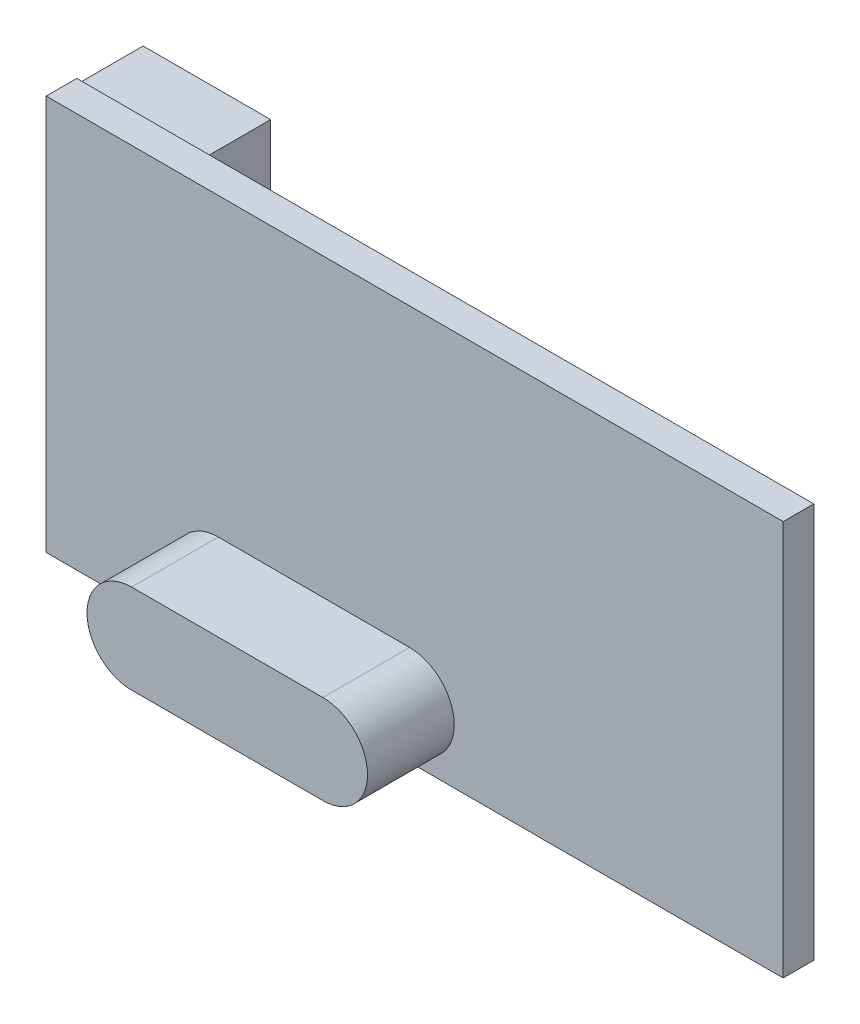
ISO-10303-21;
HEADER;
FILE_DESCRIPTION(('STEP AP214'),'2;1');
FILE_NAME('part.step','',(''),(''),'','','');
FILE_SCHEMA(('AUTOMOTIVE_DESIGN { 1 0 10303 214 1 1 1 1 }'));
ENDSEC;
DATA;
#1=APPLICATION_CONTEXT('core data for automotive mechanical design processes');
#2=APPLICATION_PROTOCOL_DEFINITION('international standard','automotive_design',2000,#1);
#3=PRODUCT_CONTEXT('',#1,'mechanical');
#4=PRODUCT('Part','Part','',(#3));
#5=PRODUCT_RELATED_PRODUCT_CATEGORY('part','',(#4));
#6=PRODUCT_DEFINITION_FORMATION('','',#4);
#7=PRODUCT_DEFINITION_CONTEXT('part definition',#1,'design');
#8=PRODUCT_DEFINITION('design','',#6,#7);
#9=PRODUCT_DEFINITION_SHAPE('','',#8);
#10=(LENGTH_UNIT() NAMED_UNIT(*) SI_UNIT(.MILLI.,.METRE.));
#11=(NAMED_UNIT(*) PLANE_ANGLE_UNIT() SI_UNIT($,.RADIAN.));
#12=(NAMED_UNIT(*) SI_UNIT($,.STERADIAN.) SOLID_ANGLE_UNIT());
#13=UNCERTAINTY_MEASURE_WITH_UNIT(LENGTH_MEASURE(1.E-05),#10,'distance_accuracy_value','');
#14=(GEOMETRIC_REPRESENTATION_CONTEXT(3) GLOBAL_UNCERTAINTY_ASSIGNED_CONTEXT((#13)) GLOBAL_UNIT_ASSIGNED_CONTEXT((#10,
#11,#12)) REPRESENTATION_CONTEXT('',''));
#15=CARTESIAN_POINT('',(0.,0.,0.));
#16=DIRECTION('',(0.,0.,1.));
#17=DIRECTION('',(1.,0.,0.));
#18=AXIS2_PLACEMENT_3D('',#15,#16,#17);
#19=CARTESIAN_POINT('',(0.,-25.6493279735981,0.));
#20=DIRECTION('',(0.,0.,1.));
#21=DIRECTION('',(1.,0.,0.));
#22=AXIS2_PLACEMENT_3D('',#19,#20,#21);
#23=PLANE('',#22);
#24=DIRECTION('',(0.,-1.,0.));
#25=VECTOR('',#24,1.);
#26=CARTESIAN_POINT('',(-14.45,-25.6493279735981,0.));
#27=LINE('',#26,#25);
#28=CARTESIAN_POINT('',(-14.45,7.75,0.));
#29=VERTEX_POINT('',#28);
#30=CARTESIAN_POINT('',(-14.45,-7.75,0.));
#31=VERTEX_POINT('',#30);
#32=EDGE_CURVE('E177',#29,#31,#27,.T.);
#33=ORIENTED_EDGE('',*,*,#32,.F.);
#34=DIRECTION('',(1.,0.,0.));
#35=VECTOR('',#34,1.);
#36=CARTESIAN_POINT('',(0.,7.75,0.));
#37=LINE('',#36,#35);
#38=CARTESIAN_POINT('',(14.45,7.75,0.));
#39=VERTEX_POINT('',#38);
#40=EDGE_CURVE('E182',#29,#39,#37,.T.);
#41=ORIENTED_EDGE('',*,*,#40,.T.);
#42=DIRECTION('',(0.,-1.,0.));
#43=VECTOR('',#42,1.);
#44=CARTESIAN_POINT('',(14.45,-25.6493279735981,0.));
#45=LINE('',#44,#43);
#46=CARTESIAN_POINT('',(14.45,-7.75,0.));
#47=VERTEX_POINT('',#46);
#48=EDGE_CURVE('E196',#39,#47,#45,.T.);
#49=ORIENTED_EDGE('',*,*,#48,.T.);
#50=DIRECTION('',(1.,0.,0.));
#51=VECTOR('',#50,1.);
#52=CARTESIAN_POINT('',(0.,-7.75,0.));
#53=LINE('',#52,#51);
#54=EDGE_CURVE('E193',#31,#47,#53,.T.);
#55=ORIENTED_EDGE('',*,*,#54,.F.);
#56=EDGE_LOOP('',(#33,#41,#49,#55));
#57=FACE_BOUND('',#56,.T.);
#58=DIRECTION('',(0.,1.,0.));
#59=VECTOR('',#58,1.);
#60=CARTESIAN_POINT('',(-14.35,7.65,0.));
#61=LINE('',#60,#59);
#62=CARTESIAN_POINT('',(-14.35,-2.35,0.));
#63=VERTEX_POINT('',#62);
#64=CARTESIAN_POINT('',(-14.35,7.65,0.));
#65=VERTEX_POINT('',#64);
#66=EDGE_CURVE('E142',#63,#65,#61,.T.);
#67=ORIENTED_EDGE('',*,*,#66,.F.);
#68=DIRECTION('',(-1.,0.,0.));
#69=VECTOR('',#68,1.);
#70=CARTESIAN_POINT('',(-14.35,-2.35,0.));
#71=LINE('',#70,#69);
#72=CARTESIAN_POINT('',(-9.35,-2.35,0.));
#73=VERTEX_POINT('',#72);
#74=EDGE_CURVE('E139',#73,#63,#71,.T.);
#75=ORIENTED_EDGE('',*,*,#74,.F.);
#76=DIRECTION('',(0.,-1.,0.));
#77=VECTOR('',#76,1.);
#78=CARTESIAN_POINT('',(-9.35,7.65,0.));
#79=LINE('',#78,#77);
#80=CARTESIAN_POINT('',(-9.35,7.65,0.));
#81=VERTEX_POINT('',#80);
#82=EDGE_CURVE('E53',#81,#73,#79,.T.);
#83=ORIENTED_EDGE('',*,*,#82,.F.);
#84=DIRECTION('',(1.,0.,0.));
#85=VECTOR('',#84,1.);
#86=CARTESIAN_POINT('',(-14.35,7.65,0.));
#87=LINE('',#86,#85);
#88=EDGE_CURVE('E48',#65,#81,#87,.T.);
#89=ORIENTED_EDGE('',*,*,#88,.F.);
#90=EDGE_LOOP('',(#67,#75,#83,#89));
#91=FACE_BOUND('',#90,.T.);
#92=ADVANCED_FACE('F33',(#57,#91),#23,.F.);
#93=CARTESIAN_POINT('',(0.,-25.6493279735981,1.2));
#94=DIRECTION('',(0.,0.,1.));
#95=DIRECTION('',(1.,0.,0.));
#96=AXIS2_PLACEMENT_3D('',#93,#94,#95);
#97=PLANE('',#96);
#98=DIRECTION('',(0.,-1.,0.));
#99=VECTOR('',#98,1.);
#100=CARTESIAN_POINT('',(-14.45,-25.6493279735981,1.2));
#101=LINE('',#100,#99);
#102=CARTESIAN_POINT('',(-14.45,7.75,1.2));
#103=VERTEX_POINT('',#102);
#104=CARTESIAN_POINT('',(-14.45,-7.75,1.2));
#105=VERTEX_POINT('',#104);
#106=EDGE_CURVE('E178',#103,#105,#101,.T.);
#107=ORIENTED_EDGE('',*,*,#106,.T.);
#108=DIRECTION('',(1.,0.,0.));
#109=VECTOR('',#108,1.);
#110=CARTESIAN_POINT('',(0.,-7.75,1.2));
#111=LINE('',#110,#109);
#112=CARTESIAN_POINT('',(14.45,-7.75,1.2));
#113=VERTEX_POINT('',#112);
#114=EDGE_CURVE('E181',#105,#113,#111,.T.);
#115=ORIENTED_EDGE('',*,*,#114,.T.);
#116=DIRECTION('',(0.,-1.,0.));
#117=VECTOR('',#116,1.);
#118=CARTESIAN_POINT('',(14.45,-25.6493279735981,1.2));
#119=LINE('',#118,#117);
#120=CARTESIAN_POINT('',(14.45,7.75,1.2));
#121=VERTEX_POINT('',#120);
#122=EDGE_CURVE('E184',#121,#113,#119,.T.);
#123=ORIENTED_EDGE('',*,*,#122,.F.);
#124=DIRECTION('',(1.,0.,0.));
#125=VECTOR('',#124,1.);
#126=CARTESIAN_POINT('',(0.,7.75,1.2));
#127=LINE('',#126,#125);
#128=EDGE_CURVE('E187',#103,#121,#127,.T.);
#129=ORIENTED_EDGE('',*,*,#128,.F.);
#130=EDGE_LOOP('',(#107,#115,#123,#129));
#131=FACE_BOUND('',#130,.T.);
#132=DIRECTION('',(1.,0.,0.));
#133=VECTOR('',#132,1.);
#134=CARTESIAN_POINT('',(-7.7,-7.35,1.2));
#135=LINE('',#134,#133);
#136=CARTESIAN_POINT('',(-7.7,-7.35,1.2));
#137=VERTEX_POINT('',#136);
#138=CARTESIAN_POINT('',(-0.199999999999999,-7.35,1.2));
#139=VERTEX_POINT('',#138);
#140=EDGE_CURVE('E146',#137,#139,#135,.T.);
#141=ORIENTED_EDGE('',*,*,#140,.F.);
#142=CARTESIAN_POINT('',(-7.7,-5.6,1.2));
#143=DIRECTION('',(0.,0.,1.));
#144=DIRECTION('',(1.,0.,0.));
#145=AXIS2_PLACEMENT_3D('',#142,#143,#144);
#146=CIRCLE('',#145,1.75);
#147=CARTESIAN_POINT('',(-7.7,-3.85,1.2));
#148=VERTEX_POINT('',#147);
#149=EDGE_CURVE('E143',#148,#137,#146,.T.);
#150=ORIENTED_EDGE('',*,*,#149,.F.);
#151=DIRECTION('',(-1.,0.,0.));
#152=VECTOR('',#151,1.);
#153=CARTESIAN_POINT('',(-7.7,-3.85,1.2));
#154=LINE('',#153,#152);
#155=CARTESIAN_POINT('',(-0.2,-3.85,1.2));
#156=VERTEX_POINT('',#155);
#157=EDGE_CURVE('E156',#156,#148,#154,.T.);
#158=ORIENTED_EDGE('',*,*,#157,.F.);
#159=CARTESIAN_POINT('',(-0.2,-5.6,1.2));
#160=DIRECTION('',(0.,0.,1.));
#161=DIRECTION('',(-1.,0.,0.));
#162=AXIS2_PLACEMENT_3D('',#159,#160,#161);
#163=CIRCLE('',#162,1.75);
#164=EDGE_CURVE('E164',#139,#156,#163,.T.);
#165=ORIENTED_EDGE('',*,*,#164,.F.);
#166=EDGE_LOOP('',(#141,#150,#158,#165));
#167=FACE_BOUND('',#166,.T.);
#168=ADVANCED_FACE('F219',(#131,#167),#97,.T.);
#169=CARTESIAN_POINT('',(-14.45,-25.6493279735981,1.2));
#170=DIRECTION('',(1.,0.,0.));
#171=DIRECTION('',(0.,1.,0.));
#172=AXIS2_PLACEMENT_3D('',#169,#170,#171);
#173=PLANE('',#172);
#174=ORIENTED_EDGE('',*,*,#32,.T.);
#175=DIRECTION('',(0.,0.,-1.));
#176=VECTOR('',#175,1.);
#177=CARTESIAN_POINT('',(-14.45,-7.75,1.2));
#178=LINE('',#177,#176);
#179=EDGE_CURVE('E11',#105,#31,#178,.T.);
#180=ORIENTED_EDGE('',*,*,#179,.F.);
#181=ORIENTED_EDGE('',*,*,#106,.F.);
#182=DIRECTION('',(0.,0.,-1.));
#183=VECTOR('',#182,1.);
#184=CARTESIAN_POINT('',(-14.45,7.75,1.2));
#185=LINE('',#184,#183);
#186=EDGE_CURVE('E190',#103,#29,#185,.T.);
#187=ORIENTED_EDGE('',*,*,#186,.T.);
#188=EDGE_LOOP('',(#174,#180,#181,#187));
#189=FACE_BOUND('',#188,.T.);
#190=ADVANCED_FACE('F35',(#189),#173,.F.);
#191=CARTESIAN_POINT('',(0.,-7.75,1.2));
#192=DIRECTION('',(0.,1.,0.));
#193=DIRECTION('',(0.,0.,1.));
#194=AXIS2_PLACEMENT_3D('',#191,#192,#193);
#195=PLANE('',#194);
#196=ORIENTED_EDGE('',*,*,#54,.T.);
#197=DIRECTION('',(0.,0.,-1.));
#198=VECTOR('',#197,1.);
#199=CARTESIAN_POINT('',(14.45,-7.75,1.2));
#200=LINE('',#199,#198);
#201=EDGE_CURVE('E41',#113,#47,#200,.T.);
#202=ORIENTED_EDGE('',*,*,#201,.F.);
#203=ORIENTED_EDGE('',*,*,#114,.F.);
#204=ORIENTED_EDGE('',*,*,#179,.T.);
#205=EDGE_LOOP('',(#196,#202,#203,#204));
#206=FACE_BOUND('',#205,.T.);
#207=ADVANCED_FACE('F209',(#206),#195,.F.);
#208=CARTESIAN_POINT('',(14.45,-25.6493279735981,1.2));
#209=DIRECTION('',(1.,0.,0.));
#210=DIRECTION('',(0.,1.,0.));
#211=AXIS2_PLACEMENT_3D('',#208,#209,#210);
#212=PLANE('',#211);
#213=ORIENTED_EDGE('',*,*,#48,.F.);
#214=DIRECTION('',(0.,0.,-1.));
#215=VECTOR('',#214,1.);
#216=CARTESIAN_POINT('',(14.45,7.75,1.2));
#217=LINE('',#216,#215);
#218=EDGE_CURVE('E202',#121,#39,#217,.T.);
#219=ORIENTED_EDGE('',*,*,#218,.F.);
#220=ORIENTED_EDGE('',*,*,#122,.T.);
#221=ORIENTED_EDGE('',*,*,#201,.T.);
#222=EDGE_LOOP('',(#213,#219,#220,#221));
#223=FACE_BOUND('',#222,.T.);
#224=ADVANCED_FACE('F206',(#223),#212,.T.);
#225=CARTESIAN_POINT('',(0.,7.75,1.2));
#226=DIRECTION('',(0.,1.,0.));
#227=DIRECTION('',(0.,0.,1.));
#228=AXIS2_PLACEMENT_3D('',#225,#226,#227);
#229=PLANE('',#228);
#230=ORIENTED_EDGE('',*,*,#40,.F.);
#231=ORIENTED_EDGE('',*,*,#186,.F.);
#232=ORIENTED_EDGE('',*,*,#128,.T.);
#233=ORIENTED_EDGE('',*,*,#218,.T.);
#234=EDGE_LOOP('',(#230,#231,#232,#233));
#235=FACE_BOUND('',#234,.T.);
#236=ADVANCED_FACE('F215',(#235),#229,.T.);
#237=CARTESIAN_POINT('',(-7.7,-5.6,4.6));
#238=DIRECTION('',(0.,0.,-1.));
#239=DIRECTION('',(-1.,0.,0.));
#240=AXIS2_PLACEMENT_3D('',#237,#238,#239);
#241=CYLINDRICAL_SURFACE('',#240,1.75);
#242=ORIENTED_EDGE('',*,*,#149,.T.);
#243=DIRECTION('',(0.,0.,-1.));
#244=VECTOR('',#243,1.);
#245=CARTESIAN_POINT('',(-7.7,-7.35,4.6));
#246=LINE('',#245,#244);
#247=CARTESIAN_POINT('',(-7.7,-7.35,4.6));
#248=VERTEX_POINT('',#247);
#249=EDGE_CURVE('E175',#248,#137,#246,.T.);
#250=ORIENTED_EDGE('',*,*,#249,.F.);
#251=CARTESIAN_POINT('',(-7.7,-5.6,4.6));
#252=DIRECTION('',(0.,0.,1.));
#253=DIRECTION('',(1.,0.,0.));
#254=AXIS2_PLACEMENT_3D('',#251,#252,#253);
#255=CIRCLE('',#254,1.75);
#256=CARTESIAN_POINT('',(-7.7,-3.85,4.6));
#257=VERTEX_POINT('',#256);
#258=EDGE_CURVE('E152',#257,#248,#255,.T.);
#259=ORIENTED_EDGE('',*,*,#258,.F.);
#260=DIRECTION('',(0.,0.,-1.));
#261=VECTOR('',#260,1.);
#262=CARTESIAN_POINT('',(-7.7,-3.85,4.6));
#263=LINE('',#262,#261);
#264=EDGE_CURVE('E161',#257,#148,#263,.T.);
#265=ORIENTED_EDGE('',*,*,#264,.T.);
#266=EDGE_LOOP('',(#242,#250,#259,#265));
#267=FACE_BOUND('',#266,.T.);
#268=ADVANCED_FACE('F236',(#267),#241,.T.);
#269=CARTESIAN_POINT('',(-7.7,-7.35,4.6));
#270=DIRECTION('',(0.,1.,0.));
#271=DIRECTION('',(0.,0.,1.));
#272=AXIS2_PLACEMENT_3D('',#269,#270,#271);
#273=PLANE('',#272);
#274=ORIENTED_EDGE('',*,*,#140,.T.);
#275=DIRECTION('',(0.,0.,-1.));
#276=VECTOR('',#275,1.);
#277=CARTESIAN_POINT('',(-0.199999999999999,-7.35,4.6));
#278=LINE('',#277,#276);
#279=CARTESIAN_POINT('',(-0.199999999999999,-7.35,4.6));
#280=VERTEX_POINT('',#279);
#281=EDGE_CURVE('E172',#280,#139,#278,.T.);
#282=ORIENTED_EDGE('',*,*,#281,.F.);
#283=DIRECTION('',(1.,0.,0.));
#284=VECTOR('',#283,1.);
#285=CARTESIAN_POINT('',(-7.7,-7.35,4.6));
#286=LINE('',#285,#284);
#287=EDGE_CURVE('E155',#248,#280,#286,.T.);
#288=ORIENTED_EDGE('',*,*,#287,.F.);
#289=ORIENTED_EDGE('',*,*,#249,.T.);
#290=EDGE_LOOP('',(#274,#282,#288,#289));
#291=FACE_BOUND('',#290,.T.);
#292=ADVANCED_FACE('F253',(#291),#273,.F.);
#293=CARTESIAN_POINT('',(-0.2,-5.6,4.6));
#294=DIRECTION('',(0.,0.,-1.));
#295=DIRECTION('',(-1.,0.,0.));
#296=AXIS2_PLACEMENT_3D('',#293,#294,#295);
#297=CYLINDRICAL_SURFACE('',#296,1.75);
#298=ORIENTED_EDGE('',*,*,#164,.T.);
#299=DIRECTION('',(0.,0.,-1.));
#300=VECTOR('',#299,1.);
#301=CARTESIAN_POINT('',(-0.2,-3.85,4.6));
#302=LINE('',#301,#300);
#303=CARTESIAN_POINT('',(-0.2,-3.85,4.6));
#304=VERTEX_POINT('',#303);
#305=EDGE_CURVE('E170',#304,#156,#302,.T.);
#306=ORIENTED_EDGE('',*,*,#305,.F.);
#307=CARTESIAN_POINT('',(-0.2,-5.6,4.6));
#308=DIRECTION('',(0.,0.,1.));
#309=DIRECTION('',(-1.,0.,0.));
#310=AXIS2_PLACEMENT_3D('',#307,#308,#309);
#311=CIRCLE('',#310,1.75);
#312=EDGE_CURVE('E158',#280,#304,#311,.T.);
#313=ORIENTED_EDGE('',*,*,#312,.F.);
#314=ORIENTED_EDGE('',*,*,#281,.T.);
#315=EDGE_LOOP('',(#298,#306,#313,#314));
#316=FACE_BOUND('',#315,.T.);
#317=ADVANCED_FACE('F260',(#316),#297,.T.);
#318=CARTESIAN_POINT('',(-7.7,-3.85,4.6));
#319=DIRECTION('',(0.,-1.,0.));
#320=DIRECTION('',(0.,0.,-1.));
#321=AXIS2_PLACEMENT_3D('',#318,#319,#320);
#322=PLANE('',#321);
#323=ORIENTED_EDGE('',*,*,#157,.T.);
#324=ORIENTED_EDGE('',*,*,#264,.F.);
#325=DIRECTION('',(-1.,0.,0.));
#326=VECTOR('',#325,1.);
#327=CARTESIAN_POINT('',(-7.7,-3.85,4.6));
#328=LINE('',#327,#326);
#329=EDGE_CURVE('E160',#304,#257,#328,.T.);
#330=ORIENTED_EDGE('',*,*,#329,.F.);
#331=ORIENTED_EDGE('',*,*,#305,.T.);
#332=EDGE_LOOP('',(#323,#324,#330,#331));
#333=FACE_BOUND('',#332,.T.);
#334=ADVANCED_FACE('F268',(#333),#322,.F.);
#335=CARTESIAN_POINT('',(-7.7,-5.6,4.6));
#336=DIRECTION('',(0.,0.,1.));
#337=DIRECTION('',(1.,0.,0.));
#338=AXIS2_PLACEMENT_3D('',#335,#336,#337);
#339=PLANE('',#338);
#340=ORIENTED_EDGE('',*,*,#258,.T.);
#341=ORIENTED_EDGE('',*,*,#287,.T.);
#342=ORIENTED_EDGE('',*,*,#312,.T.);
#343=ORIENTED_EDGE('',*,*,#329,.T.);
#344=EDGE_LOOP('',(#340,#341,#342,#343));
#345=FACE_BOUND('',#344,.T.);
#346=ADVANCED_FACE('F276',(#345),#339,.T.);
#347=CARTESIAN_POINT('',(-14.35,7.65,-2.5));
#348=DIRECTION('',(1.,0.,0.));
#349=DIRECTION('',(0.,0.,-1.));
#350=AXIS2_PLACEMENT_3D('',#347,#348,#349);
#351=PLANE('',#350);
#352=ORIENTED_EDGE('',*,*,#66,.T.);
#353=DIRECTION('',(0.,0.,1.));
#354=VECTOR('',#353,1.);
#355=CARTESIAN_POINT('',(-14.35,7.65,-2.5));
#356=LINE('',#355,#354);
#357=CARTESIAN_POINT('',(-14.35,7.65,-2.5));
#358=VERTEX_POINT('',#357);
#359=EDGE_CURVE('E123',#358,#65,#356,.T.);
#360=ORIENTED_EDGE('',*,*,#359,.F.);
#361=DIRECTION('',(0.,1.,0.));
#362=VECTOR('',#361,1.);
#363=CARTESIAN_POINT('',(-14.35,7.65,-2.5));
#364=LINE('',#363,#362);
#365=CARTESIAN_POINT('',(-14.35,-2.35,-2.5));
#366=VERTEX_POINT('',#365);
#367=EDGE_CURVE('E130',#366,#358,#364,.T.);
#368=ORIENTED_EDGE('',*,*,#367,.F.);
#369=DIRECTION('',(0.,0.,1.));
#370=VECTOR('',#369,1.);
#371=CARTESIAN_POINT('',(-14.35,-2.35,-2.5));
#372=LINE('',#371,#370);
#373=EDGE_CURVE('E370',#366,#63,#372,.T.);
#374=ORIENTED_EDGE('',*,*,#373,.T.);
#375=EDGE_LOOP('',(#352,#360,#368,#374));
#376=FACE_BOUND('',#375,.T.);
#377=ADVANCED_FACE('F141',(#376),#351,.F.);
#378=CARTESIAN_POINT('',(-14.35,7.65,-2.5));
#379=DIRECTION('',(0.,-1.,0.));
#380=DIRECTION('',(1.,0.,0.));
#381=AXIS2_PLACEMENT_3D('',#378,#379,#380);
#382=PLANE('',#381);
#383=ORIENTED_EDGE('',*,*,#88,.T.);
#384=DIRECTION('',(0.,0.,1.));
#385=VECTOR('',#384,1.);
#386=CARTESIAN_POINT('',(-9.35,7.65,-2.5));
#387=LINE('',#386,#385);
#388=CARTESIAN_POINT('',(-9.35,7.65,-2.5));
#389=VERTEX_POINT('',#388);
#390=EDGE_CURVE('E126',#389,#81,#387,.T.);
#391=ORIENTED_EDGE('',*,*,#390,.F.);
#392=DIRECTION('',(1.,0.,0.));
#393=VECTOR('',#392,1.);
#394=CARTESIAN_POINT('',(-14.35,7.65,-2.5));
#395=LINE('',#394,#393);
#396=EDGE_CURVE('E119',#358,#389,#395,.T.);
#397=ORIENTED_EDGE('',*,*,#396,.F.);
#398=ORIENTED_EDGE('',*,*,#359,.T.);
#399=EDGE_LOOP('',(#383,#391,#397,#398));
#400=FACE_BOUND('',#399,.T.);
#401=ADVANCED_FACE('F121',(#400),#382,.F.);
#402=CARTESIAN_POINT('',(-9.35,7.65,-2.5));
#403=DIRECTION('',(-1.,0.,0.));
#404=DIRECTION('',(0.,-1.,0.));
#405=AXIS2_PLACEMENT_3D('',#402,#403,#404);
#406=PLANE('',#405);
#407=ORIENTED_EDGE('',*,*,#82,.T.);
#408=DIRECTION('',(0.,0.,1.));
#409=VECTOR('',#408,1.);
#410=CARTESIAN_POINT('',(-9.35,-2.35,-2.5));
#411=LINE('',#410,#409);
#412=CARTESIAN_POINT('',(-9.35,-2.35,-2.5));
#413=VERTEX_POINT('',#412);
#414=EDGE_CURVE('E148',#413,#73,#411,.T.);
#415=ORIENTED_EDGE('',*,*,#414,.F.);
#416=DIRECTION('',(0.,-1.,0.));
#417=VECTOR('',#416,1.);
#418=CARTESIAN_POINT('',(-9.35,7.65,-2.5));
#419=LINE('',#418,#417);
#420=EDGE_CURVE('E129',#389,#413,#419,.T.);
#421=ORIENTED_EDGE('',*,*,#420,.F.);
#422=ORIENTED_EDGE('',*,*,#390,.T.);
#423=EDGE_LOOP('',(#407,#415,#421,#422));
#424=FACE_BOUND('',#423,.T.);
#425=ADVANCED_FACE('F297',(#424),#406,.F.);
#426=CARTESIAN_POINT('',(-14.35,-2.35,-2.5));
#427=DIRECTION('',(0.,1.,0.));
#428=DIRECTION('',(-1.,0.,0.));
#429=AXIS2_PLACEMENT_3D('',#426,#427,#428);
#430=PLANE('',#429);
#431=ORIENTED_EDGE('',*,*,#74,.T.);
#432=ORIENTED_EDGE('',*,*,#373,.F.);
#433=DIRECTION('',(-1.,0.,0.));
#434=VECTOR('',#433,1.);
#435=CARTESIAN_POINT('',(-14.35,-2.35,-2.5));
#436=LINE('',#435,#434);
#437=EDGE_CURVE('E135',#413,#366,#436,.T.);
#438=ORIENTED_EDGE('',*,*,#437,.F.);
#439=ORIENTED_EDGE('',*,*,#414,.T.);
#440=EDGE_LOOP('',(#431,#432,#438,#439));
#441=FACE_BOUND('',#440,.T.);
#442=ADVANCED_FACE('F304',(#441),#430,.F.);
#443=CARTESIAN_POINT('',(-14.35,-2.35,-2.5));
#444=DIRECTION('',(0.,0.,1.));
#445=DIRECTION('',(1.,0.,0.));
#446=AXIS2_PLACEMENT_3D('',#443,#444,#445);
#447=PLANE('',#446);
#448=ORIENTED_EDGE('',*,*,#367,.T.);
#449=ORIENTED_EDGE('',*,*,#396,.T.);
#450=ORIENTED_EDGE('',*,*,#420,.T.);
#451=ORIENTED_EDGE('',*,*,#437,.T.);
#452=EDGE_LOOP('',(#448,#449,#450,#451));
#453=FACE_BOUND('',#452,.T.);
#454=ADVANCED_FACE('F133',(#453),#447,.F.);
#455=CLOSED_SHELL('',(#92,#168,#190,#207,#224,#236,#268,#292,#317,#334,#346,#377,#401,#425,#442,#454));
#456=MANIFOLD_SOLID_BREP('B2',#455);
#457=ADVANCED_BREP_SHAPE_REPRESENTATION('',(#18,#456),#14);
#458=SHAPE_DEFINITION_REPRESENTATION(#9,#457);
ENDSEC;
END-ISO-10303-21;
